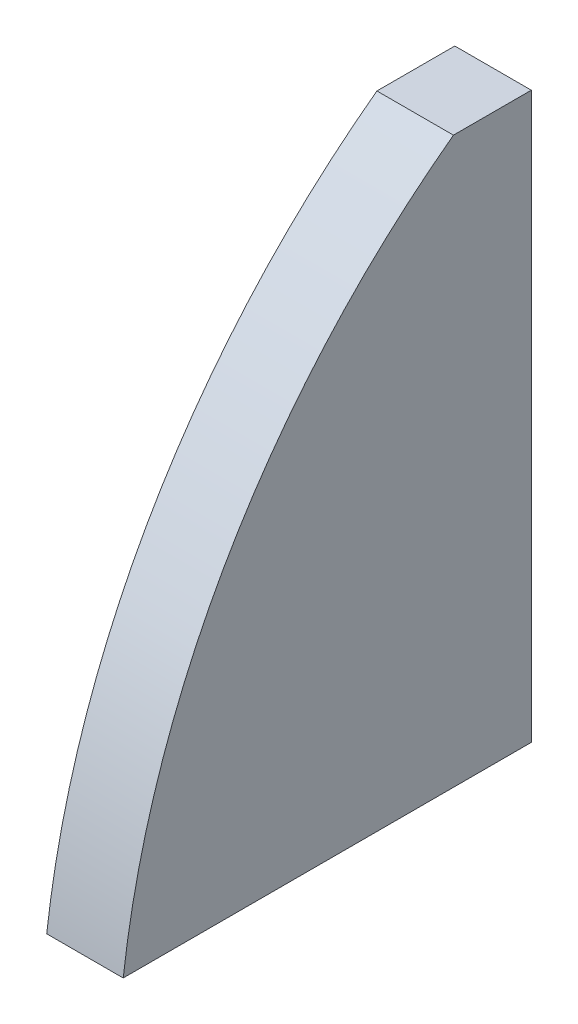
ISO-10303-21;
HEADER;
FILE_DESCRIPTION(('STEP AP214'),'2;1');
FILE_NAME('part.step','',(''),(''),'','','');
FILE_SCHEMA(('AUTOMOTIVE_DESIGN { 1 0 10303 214 1 1 1 1 }'));
ENDSEC;
DATA;
#1=APPLICATION_CONTEXT('core data for automotive mechanical design processes');
#2=APPLICATION_PROTOCOL_DEFINITION('international standard','automotive_design',2000,#1);
#3=PRODUCT_CONTEXT('',#1,'mechanical');
#4=PRODUCT('Part','Part','',(#3));
#5=PRODUCT_RELATED_PRODUCT_CATEGORY('part','',(#4));
#6=PRODUCT_DEFINITION_FORMATION('','',#4);
#7=PRODUCT_DEFINITION_CONTEXT('part definition',#1,'design');
#8=PRODUCT_DEFINITION('design','',#6,#7);
#9=PRODUCT_DEFINITION_SHAPE('','',#8);
#10=(LENGTH_UNIT() NAMED_UNIT(*) SI_UNIT(.MILLI.,.METRE.));
#11=(NAMED_UNIT(*) PLANE_ANGLE_UNIT() SI_UNIT($,.RADIAN.));
#12=(NAMED_UNIT(*) SI_UNIT($,.STERADIAN.) SOLID_ANGLE_UNIT());
#13=UNCERTAINTY_MEASURE_WITH_UNIT(LENGTH_MEASURE(1.E-05),#10,'distance_accuracy_value','');
#14=(GEOMETRIC_REPRESENTATION_CONTEXT(3) GLOBAL_UNCERTAINTY_ASSIGNED_CONTEXT((#13)) GLOBAL_UNIT_ASSIGNED_CONTEXT((#10,
#11,#12)) REPRESENTATION_CONTEXT('',''));
#15=CARTESIAN_POINT('',(0.,0.,0.));
#16=DIRECTION('',(0.,0.,1.));
#17=DIRECTION('',(1.,0.,0.));
#18=AXIS2_PLACEMENT_3D('',#15,#16,#17);
#19=CARTESIAN_POINT('',(150.,0.,0.));
#20=DIRECTION('',(-1.,0.,0.));
#21=DIRECTION('',(0.,0.,1.));
#22=AXIS2_PLACEMENT_3D('',#19,#20,#21);
#23=CYLINDRICAL_SURFACE('',#22,1625.);
#24=CARTESIAN_POINT('',(150.,0.,0.));
#25=DIRECTION('',(1.,0.,0.));
#26=DIRECTION('',(0.,0.,-1.));
#27=AXIS2_PLACEMENT_3D('',#24,#25,#26);
#28=CIRCLE('',#27,1625.);
#29=CARTESIAN_POINT('',(150.,1307.20735773347,965.315453044999));
#30=VERTEX_POINT('',#29);
#31=CARTESIAN_POINT('',(150.,200.,1612.64534228701));
#32=VERTEX_POINT('',#31);
#33=EDGE_CURVE('E74',#30,#32,#28,.T.);
#34=ORIENTED_EDGE('',*,*,#33,.F.);
#35=DIRECTION('',(-1.,0.,0.));
#36=VECTOR('',#35,1.);
#37=CARTESIAN_POINT('',(150.,1307.20735773347,965.315453044999));
#38=LINE('',#37,#36);
#39=CARTESIAN_POINT('',(0.,1307.20735773347,965.315453044999));
#40=VERTEX_POINT('',#39);
#41=EDGE_CURVE('E96',#30,#40,#38,.T.);
#42=ORIENTED_EDGE('',*,*,#41,.T.);
#43=CARTESIAN_POINT('',(0.,0.,0.));
#44=DIRECTION('',(1.,0.,0.));
#45=DIRECTION('',(0.,0.,-1.));
#46=AXIS2_PLACEMENT_3D('',#43,#44,#45);
#47=CIRCLE('',#46,1625.);
#48=CARTESIAN_POINT('',(0.,200.,1612.64534228701));
#49=VERTEX_POINT('',#48);
#50=EDGE_CURVE('E94',#40,#49,#47,.T.);
#51=ORIENTED_EDGE('',*,*,#50,.T.);
#52=DIRECTION('',(-1.,0.,0.));
#53=VECTOR('',#52,1.);
#54=CARTESIAN_POINT('',(150.,200.,1612.64534228701));
#55=LINE('',#54,#53);
#56=EDGE_CURVE('E89',#32,#49,#55,.T.);
#57=ORIENTED_EDGE('',*,*,#56,.F.);
#58=EDGE_LOOP('',(#34,#42,#51,#57));
#59=FACE_BOUND('',#58,.T.);
#60=ADVANCED_FACE('F34',(#59),#23,.T.);
#61=CARTESIAN_POINT('',(150.,200.,1612.64534228701));
#62=DIRECTION('',(0.,1.,0.));
#63=DIRECTION('',(0.,0.,1.));
#64=AXIS2_PLACEMENT_3D('',#61,#62,#63);
#65=PLANE('',#64);
#66=DIRECTION('',(0.,0.,-1.));
#67=VECTOR('',#66,1.);
#68=CARTESIAN_POINT('',(0.,200.,1612.64534228701));
#69=LINE('',#68,#67);
#70=CARTESIAN_POINT('',(0.,200.,812.645342287014));
#71=VERTEX_POINT('',#70);
#72=EDGE_CURVE('E103',#49,#71,#69,.T.);
#73=ORIENTED_EDGE('',*,*,#72,.T.);
#74=DIRECTION('',(-1.,0.,0.));
#75=VECTOR('',#74,1.);
#76=CARTESIAN_POINT('',(150.,200.,812.645342287014));
#77=LINE('',#76,#75);
#78=CARTESIAN_POINT('',(150.,200.,812.645342287014));
#79=VERTEX_POINT('',#78);
#80=EDGE_CURVE('E91',#79,#71,#77,.T.);
#81=ORIENTED_EDGE('',*,*,#80,.F.);
#82=DIRECTION('',(0.,0.,-1.));
#83=VECTOR('',#82,1.);
#84=CARTESIAN_POINT('',(150.,200.,1612.64534228701));
#85=LINE('',#84,#83);
#86=EDGE_CURVE('E77',#32,#79,#85,.T.);
#87=ORIENTED_EDGE('',*,*,#86,.F.);
#88=ORIENTED_EDGE('',*,*,#56,.T.);
#89=EDGE_LOOP('',(#73,#81,#87,#88));
#90=FACE_BOUND('',#89,.T.);
#91=ADVANCED_FACE('F88',(#90),#65,.F.);
#92=CARTESIAN_POINT('',(150.,200.,812.645342287014));
#93=DIRECTION('',(0.,0.,1.));
#94=DIRECTION('',(1.,0.,0.));
#95=AXIS2_PLACEMENT_3D('',#92,#93,#94);
#96=PLANE('',#95);
#97=DIRECTION('',(0.,1.,0.));
#98=VECTOR('',#97,1.);
#99=CARTESIAN_POINT('',(0.,200.,812.645342287014));
#100=LINE('',#99,#98);
#101=CARTESIAN_POINT('',(0.,1307.20735773347,812.645342287014));
#102=VERTEX_POINT('',#101);
#103=EDGE_CURVE('E84',#71,#102,#100,.T.);
#104=ORIENTED_EDGE('',*,*,#103,.T.);
#105=DIRECTION('',(1.,0.,0.));
#106=VECTOR('',#105,1.);
#107=CARTESIAN_POINT('',(150.,1307.20735773347,812.645342287014));
#108=LINE('',#107,#106);
#109=CARTESIAN_POINT('',(150.,1307.20735773347,812.645342287014));
#110=VERTEX_POINT('',#109);
#111=EDGE_CURVE('E42',#102,#110,#108,.T.);
#112=ORIENTED_EDGE('',*,*,#111,.T.);
#113=DIRECTION('',(0.,1.,0.));
#114=VECTOR('',#113,1.);
#115=CARTESIAN_POINT('',(150.,200.,812.645342287014));
#116=LINE('',#115,#114);
#117=EDGE_CURVE('E92',#79,#110,#116,.T.);
#118=ORIENTED_EDGE('',*,*,#117,.F.);
#119=ORIENTED_EDGE('',*,*,#80,.T.);
#120=EDGE_LOOP('',(#104,#112,#118,#119));
#121=FACE_BOUND('',#120,.T.);
#122=ADVANCED_FACE('F108',(#121),#96,.F.);
#123=CARTESIAN_POINT('',(150.,0.,0.));
#124=DIRECTION('',(1.,0.,0.));
#125=DIRECTION('',(0.,0.,-1.));
#126=AXIS2_PLACEMENT_3D('',#123,#124,#125);
#127=PLANE('',#126);
#128=ORIENTED_EDGE('',*,*,#117,.T.);
#129=DIRECTION('',(0.,0.,-1.));
#130=VECTOR('',#129,1.);
#131=CARTESIAN_POINT('',(150.,1307.20735773347,-3.80242524043417E-12));
#132=LINE('',#131,#130);
#133=EDGE_CURVE('E11',#110,#30,#132,.F.);
#134=ORIENTED_EDGE('',*,*,#133,.T.);
#135=ORIENTED_EDGE('',*,*,#33,.T.);
#136=ORIENTED_EDGE('',*,*,#86,.T.);
#137=EDGE_LOOP('',(#128,#134,#135,#136));
#138=FACE_BOUND('',#137,.T.);
#139=ADVANCED_FACE('F76',(#138),#127,.T.);
#140=CARTESIAN_POINT('',(0.,0.,0.));
#141=DIRECTION('',(1.,0.,0.));
#142=DIRECTION('',(0.,0.,-1.));
#143=AXIS2_PLACEMENT_3D('',#140,#141,#142);
#144=PLANE('',#143);
#145=ORIENTED_EDGE('',*,*,#50,.F.);
#146=DIRECTION('',(0.,0.,1.));
#147=VECTOR('',#146,1.);
#148=CARTESIAN_POINT('',(0.,1307.20735773347,965.315453044999));
#149=LINE('',#148,#147);
#150=EDGE_CURVE('E56',#40,#102,#149,.F.);
#151=ORIENTED_EDGE('',*,*,#150,.T.);
#152=ORIENTED_EDGE('',*,*,#103,.F.);
#153=ORIENTED_EDGE('',*,*,#72,.F.);
#154=EDGE_LOOP('',(#145,#151,#152,#153));
#155=FACE_BOUND('',#154,.T.);
#156=ADVANCED_FACE('F107',(#155),#144,.F.);
#157=CARTESIAN_POINT('',(150.,1307.20735773347,965.315453044999));
#158=DIRECTION('',(0.,-1.,0.));
#159=DIRECTION('',(-1.,0.,0.));
#160=AXIS2_PLACEMENT_3D('',#157,#158,#159);
#161=PLANE('',#160);
#162=ORIENTED_EDGE('',*,*,#133,.F.);
#163=ORIENTED_EDGE('',*,*,#111,.F.);
#164=ORIENTED_EDGE('',*,*,#150,.F.);
#165=ORIENTED_EDGE('',*,*,#41,.F.);
#166=EDGE_LOOP('',(#162,#163,#164,#165));
#167=FACE_BOUND('',#166,.T.);
#168=ADVANCED_FACE('F36',(#167),#161,.F.);
#169=CLOSED_SHELL('',(#60,#91,#122,#139,#156,#168));
#170=MANIFOLD_SOLID_BREP('B2',#169);
#171=ADVANCED_BREP_SHAPE_REPRESENTATION('',(#18,#170),#14);
#172=SHAPE_DEFINITION_REPRESENTATION(#9,#171);
ENDSEC;
END-ISO-10303-21;
